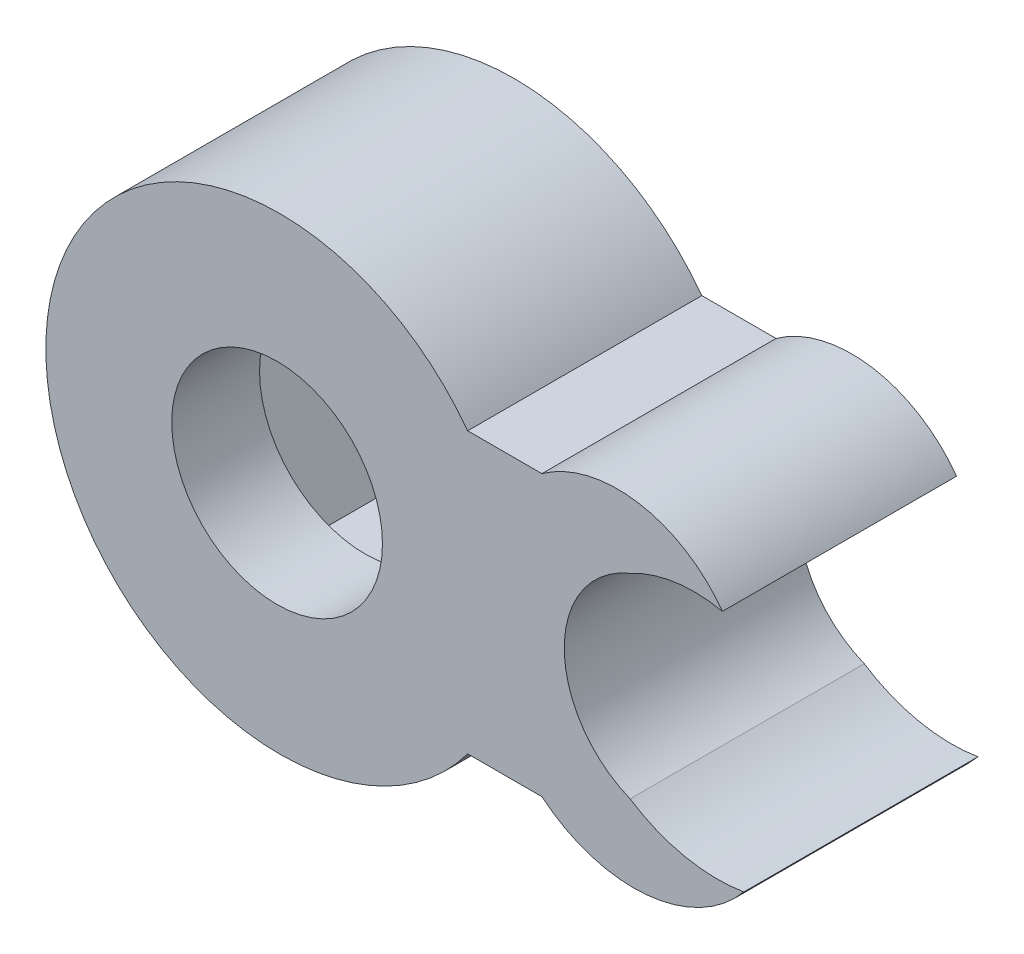
ISO-10303-21;
HEADER;
FILE_DESCRIPTION(('STEP AP214'),'2;1');
FILE_NAME('part.step','',(''),(''),'','','');
FILE_SCHEMA(('AUTOMOTIVE_DESIGN { 1 0 10303 214 1 1 1 1 }'));
ENDSEC;
DATA;
#1=APPLICATION_CONTEXT('core data for automotive mechanical design processes');
#2=APPLICATION_PROTOCOL_DEFINITION('international standard','automotive_design',2000,#1);
#3=PRODUCT_CONTEXT('',#1,'mechanical');
#4=PRODUCT('Part','Part','',(#3));
#5=PRODUCT_RELATED_PRODUCT_CATEGORY('part','',(#4));
#6=PRODUCT_DEFINITION_FORMATION('','',#4);
#7=PRODUCT_DEFINITION_CONTEXT('part definition',#1,'design');
#8=PRODUCT_DEFINITION('design','',#6,#7);
#9=PRODUCT_DEFINITION_SHAPE('','',#8);
#10=(LENGTH_UNIT() NAMED_UNIT(*) SI_UNIT(.MILLI.,.METRE.));
#11=(NAMED_UNIT(*) PLANE_ANGLE_UNIT() SI_UNIT($,.RADIAN.));
#12=(NAMED_UNIT(*) SI_UNIT($,.STERADIAN.) SOLID_ANGLE_UNIT());
#13=UNCERTAINTY_MEASURE_WITH_UNIT(LENGTH_MEASURE(1.E-05),#10,'distance_accuracy_value','');
#14=(GEOMETRIC_REPRESENTATION_CONTEXT(3) GLOBAL_UNCERTAINTY_ASSIGNED_CONTEXT((#13)) GLOBAL_UNIT_ASSIGNED_CONTEXT((#10,
#11,#12)) REPRESENTATION_CONTEXT('',''));
#15=CARTESIAN_POINT('',(0.,0.,0.));
#16=DIRECTION('',(0.,0.,1.));
#17=DIRECTION('',(1.,0.,0.));
#18=AXIS2_PLACEMENT_3D('',#15,#16,#17);
#19=CARTESIAN_POINT('',(0.,0.,0.));
#20=DIRECTION('',(0.,0.,1.));
#21=DIRECTION('',(1.,0.,0.));
#22=AXIS2_PLACEMENT_3D('',#19,#20,#21);
#23=PLANE('',#22);
#24=CARTESIAN_POINT('',(8.62330334265055,5.97504165381656,0.));
#25=DIRECTION('',(0.,0.,1.));
#26=DIRECTION('',(1.,0.,0.));
#27=AXIS2_PLACEMENT_3D('',#24,#25,#26);
#28=CIRCLE('',#27,4.5);
#29=CARTESIAN_POINT('',(6.93580334265055,10.1466533028079,0.));
#30=VERTEX_POINT('',#29);
#31=CARTESIAN_POINT('',(6.93580334265055,1.80343000482525,0.));
#32=VERTEX_POINT('',#31);
#33=EDGE_CURVE('E196',#30,#32,#28,.T.);
#34=ORIENTED_EDGE('',*,*,#33,.T.);
#35=CARTESIAN_POINT('',(10.6684287310235,7.53877576080524,0.));
#36=DIRECTION('',(0.,0.,1.));
#37=DIRECTION('',(-1.,0.,0.));
#38=AXIS2_PLACEMENT_3D('',#35,#36,#37);
#39=CIRCLE('',#38,6.84300250113675);
#40=CARTESIAN_POINT('',(11.795192236615,0.789176718415332,0.));
#41=VERTEX_POINT('',#40);
#42=EDGE_CURVE('E157',#32,#41,#39,.T.);
#43=ORIENTED_EDGE('',*,*,#42,.T.);
#44=CARTESIAN_POINT('',(7.08800775909984,4.70718447751529,0.));
#45=DIRECTION('',(0.,0.,-1.));
#46=DIRECTION('',(1.,0.,0.));
#47=AXIS2_PLACEMENT_3D('',#44,#45,#46);
#48=CIRCLE('',#47,6.12440776775415);
#49=CARTESIAN_POINT('',(3.17,0.,0.));
#50=VERTEX_POINT('',#49);
#51=EDGE_CURVE('E180',#41,#50,#48,.T.);
#52=ORIENTED_EDGE('',*,*,#51,.T.);
#53=DIRECTION('',(1.,0.,0.));
#54=VECTOR('',#53,1.);
#55=CARTESIAN_POINT('',(0.,0.,0.));
#56=LINE('',#55,#54);
#57=CARTESIAN_POINT('',(0.,0.,0.));
#58=VERTEX_POINT('',#57);
#59=EDGE_CURVE('E240',#58,#50,#56,.T.);
#60=ORIENTED_EDGE('',*,*,#59,.F.);
#61=CARTESIAN_POINT('',(-8.01865806947503,5.97504165381656,0.));
#62=DIRECTION('',(0.,0.,1.));
#63=DIRECTION('',(1.,0.,0.));
#64=AXIS2_PLACEMENT_3D('',#61,#62,#63);
#65=CIRCLE('',#64,10.);
#66=CARTESIAN_POINT('',(0.,11.9500833076331,0.));
#67=VERTEX_POINT('',#66);
#68=EDGE_CURVE('E243',#58,#67,#65,.F.);
#69=ORIENTED_EDGE('',*,*,#68,.T.);
#70=DIRECTION('',(1.,0.,0.));
#71=VECTOR('',#70,1.);
#72=CARTESIAN_POINT('',(0.,11.9500833076331,0.));
#73=LINE('',#72,#71);
#74=CARTESIAN_POINT('',(3.17,11.9500833076331,0.));
#75=VERTEX_POINT('',#74);
#76=EDGE_CURVE('E248',#67,#75,#73,.T.);
#77=ORIENTED_EDGE('',*,*,#76,.T.);
#78=CARTESIAN_POINT('',(6.40495500687242,7.47531307316342,0.));
#79=DIRECTION('',(0.,0.,-1.));
#80=DIRECTION('',(-1.,0.,0.));
#81=AXIS2_PLACEMENT_3D('',#78,#79,#80);
#82=CIRCLE('',#81,5.52163948006251);
#83=CARTESIAN_POINT('',(10.8797252413417,10.7102680800364,0.));
#84=VERTEX_POINT('',#83);
#85=EDGE_CURVE('E173',#75,#84,#82,.T.);
#86=ORIENTED_EDGE('',*,*,#85,.T.);
#87=CARTESIAN_POINT('',(9.67773467791841,5.04055535417208,0.));
#88=DIRECTION('',(0.,0.,1.));
#89=DIRECTION('',(-1.,0.,0.));
#90=AXIS2_PLACEMENT_3D('',#87,#88,#89);
#91=CIRCLE('',#90,5.79572460598211);
#92=EDGE_CURVE('E153',#84,#30,#91,.T.);
#93=ORIENTED_EDGE('',*,*,#92,.T.);
#94=EDGE_LOOP('',(#34,#43,#52,#60,#69,#77,#86,#93));
#95=FACE_BOUND('',#94,.T.);
#96=DIRECTION('',(0.999759336349186,-0.0219378527353114,0.));
#97=VECTOR('',#96,1.);
#98=CARTESIAN_POINT('',(-12.003000081239,-0.589130195444066,0.));
#99=LINE('',#98,#97);
#100=CARTESIAN_POINT('',(-12.003000081239,-0.589130195444065,0.));
#101=VERTEX_POINT('',#100);
#102=CARTESIAN_POINT('',(-4.32608949909066,-0.757585670366985,0.));
#103=VERTEX_POINT('',#102);
#104=EDGE_CURVE('E50',#101,#103,#99,.T.);
#105=ORIENTED_EDGE('',*,*,#104,.T.);
#106=DIRECTION('',(0.518878405947854,0.85484805658141,0.));
#107=VECTOR('',#106,1.);
#108=CARTESIAN_POINT('',(-4.32608949909066,-0.757585670366985,0.));
#109=LINE('',#108,#107);
#110=CARTESIAN_POINT('',(-0.341747487326646,5.80658617889364,0.));
#111=VERTEX_POINT('',#110);
#112=EDGE_CURVE('E215',#103,#111,#109,.T.);
#113=ORIENTED_EDGE('',*,*,#112,.T.);
#114=DIRECTION('',(-0.480880930401331,0.876785909316721,0.));
#115=VECTOR('',#114,1.);
#116=CARTESIAN_POINT('',(-0.341747487326646,5.80658617889364,0.));
#117=LINE('',#116,#115);
#118=CARTESIAN_POINT('',(-4.03431605771102,12.5392135030772,0.));
#119=VERTEX_POINT('',#118);
#120=EDGE_CURVE('E218',#111,#119,#117,.T.);
#121=ORIENTED_EDGE('',*,*,#120,.T.);
#122=DIRECTION('',(-0.999759336349186,0.0219378527353115,0.));
#123=VECTOR('',#122,1.);
#124=CARTESIAN_POINT('',(-4.03431605771102,12.5392135030772,0.));
#125=LINE('',#124,#123);
#126=CARTESIAN_POINT('',(-11.7112266398594,12.7076689780001,0.));
#127=VERTEX_POINT('',#126);
#128=EDGE_CURVE('E221',#119,#127,#125,.T.);
#129=ORIENTED_EDGE('',*,*,#128,.T.);
#130=DIRECTION('',(-0.518878405947854,-0.85484805658141,0.));
#131=VECTOR('',#130,1.);
#132=CARTESIAN_POINT('',(-11.7112266398594,12.7076689780001,0.));
#133=LINE('',#132,#131);
#134=CARTESIAN_POINT('',(-15.6955686516234,6.14349712873948,0.));
#135=VERTEX_POINT('',#134);
#136=EDGE_CURVE('E224',#127,#135,#133,.T.);
#137=ORIENTED_EDGE('',*,*,#136,.T.);
#138=DIRECTION('',(0.480880930401331,-0.876785909316722,0.));
#139=VECTOR('',#138,1.);
#140=CARTESIAN_POINT('',(-15.6955686516234,6.14349712873948,0.));
#141=LINE('',#140,#139);
#142=EDGE_CURVE('E203',#135,#101,#141,.T.);
#143=ORIENTED_EDGE('',*,*,#142,.T.);
#144=EDGE_LOOP('',(#105,#113,#121,#129,#137,#143));
#145=FACE_BOUND('',#144,.T.);
#146=ADVANCED_FACE('F35',(#95,#145),#23,.F.);
#147=CARTESIAN_POINT('',(0.,0.,10.));
#148=DIRECTION('',(0.,1.,0.));
#149=DIRECTION('',(0.,0.,1.));
#150=AXIS2_PLACEMENT_3D('',#147,#148,#149);
#151=PLANE('',#150);
#152=ORIENTED_EDGE('',*,*,#59,.T.);
#153=DIRECTION('',(0.,0.,-1.));
#154=VECTOR('',#153,1.);
#155=CARTESIAN_POINT('',(3.17,0.,10.));
#156=LINE('',#155,#154);
#157=CARTESIAN_POINT('',(3.17,0.,10.));
#158=VERTEX_POINT('',#157);
#159=EDGE_CURVE('E257',#158,#50,#156,.T.);
#160=ORIENTED_EDGE('',*,*,#159,.F.);
#161=DIRECTION('',(1.,0.,0.));
#162=VECTOR('',#161,1.);
#163=CARTESIAN_POINT('',(0.,0.,10.));
#164=LINE('',#163,#162);
#165=CARTESIAN_POINT('',(0.,0.,10.));
#166=VERTEX_POINT('',#165);
#167=EDGE_CURVE('E84',#166,#158,#164,.T.);
#168=ORIENTED_EDGE('',*,*,#167,.F.);
#169=DIRECTION('',(0.,0.,-1.));
#170=VECTOR('',#169,1.);
#171=CARTESIAN_POINT('',(0.,0.,10.));
#172=LINE('',#171,#170);
#173=EDGE_CURVE('E59',#166,#58,#172,.T.);
#174=ORIENTED_EDGE('',*,*,#173,.T.);
#175=EDGE_LOOP('',(#152,#160,#168,#174));
#176=FACE_BOUND('',#175,.T.);
#177=ADVANCED_FACE('F37',(#176),#151,.F.);
#178=CARTESIAN_POINT('',(0.,11.9500833076331,10.));
#179=DIRECTION('',(0.,1.,0.));
#180=DIRECTION('',(0.,0.,1.));
#181=AXIS2_PLACEMENT_3D('',#178,#179,#180);
#182=PLANE('',#181);
#183=ORIENTED_EDGE('',*,*,#76,.F.);
#184=DIRECTION('',(0.,0.,-1.));
#185=VECTOR('',#184,1.);
#186=CARTESIAN_POINT('',(0.,11.9500833076331,10.));
#187=LINE('',#186,#185);
#188=CARTESIAN_POINT('',(0.,11.9500833076331,10.));
#189=VERTEX_POINT('',#188);
#190=EDGE_CURVE('E254',#189,#67,#187,.T.);
#191=ORIENTED_EDGE('',*,*,#190,.F.);
#192=DIRECTION('',(1.,0.,0.));
#193=VECTOR('',#192,1.);
#194=CARTESIAN_POINT('',(0.,11.9500833076331,10.));
#195=LINE('',#194,#193);
#196=CARTESIAN_POINT('',(3.17,11.9500833076331,10.));
#197=VERTEX_POINT('',#196);
#198=EDGE_CURVE('E242',#189,#197,#195,.T.);
#199=ORIENTED_EDGE('',*,*,#198,.T.);
#200=DIRECTION('',(0.,0.,-1.));
#201=VECTOR('',#200,1.);
#202=CARTESIAN_POINT('',(3.17,11.9500833076331,10.));
#203=LINE('',#202,#201);
#204=EDGE_CURVE('E163',#197,#75,#203,.T.);
#205=ORIENTED_EDGE('',*,*,#204,.T.);
#206=EDGE_LOOP('',(#183,#191,#199,#205));
#207=FACE_BOUND('',#206,.T.);
#208=ADVANCED_FACE('F265',(#207),#182,.T.);
#209=CARTESIAN_POINT('',(-8.01865806947503,5.97504165381656,10.));
#210=DIRECTION('',(0.,0.,-1.));
#211=DIRECTION('',(-1.,0.,0.));
#212=AXIS2_PLACEMENT_3D('',#209,#210,#211);
#213=CYLINDRICAL_SURFACE('',#212,10.);
#214=ORIENTED_EDGE('',*,*,#68,.F.);
#215=ORIENTED_EDGE('',*,*,#173,.F.);
#216=CARTESIAN_POINT('',(-8.01865806947503,5.97504165381656,10.));
#217=DIRECTION('',(0.,0.,1.));
#218=DIRECTION('',(1.,0.,0.));
#219=AXIS2_PLACEMENT_3D('',#216,#217,#218);
#220=CIRCLE('',#219,10.);
#221=EDGE_CURVE('E245',#166,#189,#220,.F.);
#222=ORIENTED_EDGE('',*,*,#221,.T.);
#223=ORIENTED_EDGE('',*,*,#190,.T.);
#224=EDGE_LOOP('',(#214,#215,#222,#223));
#225=FACE_BOUND('',#224,.T.);
#226=ADVANCED_FACE('F266',(#225),#213,.T.);
#227=CARTESIAN_POINT('',(0.,0.,10.));
#228=DIRECTION('',(0.,0.,1.));
#229=DIRECTION('',(1.,0.,0.));
#230=AXIS2_PLACEMENT_3D('',#227,#228,#229);
#231=PLANE('',#230);
#232=CARTESIAN_POINT('',(8.62330334267549,5.97504165381656,10.));
#233=DIRECTION('',(0.,0.,1.));
#234=DIRECTION('',(1.,0.,0.));
#235=AXIS2_PLACEMENT_3D('',#232,#233,#234);
#236=CIRCLE('',#235,4.50000000000935);
#237=CARTESIAN_POINT('',(6.93580334265055,10.1466533028079,10.));
#238=VERTEX_POINT('',#237);
#239=CARTESIAN_POINT('',(6.93580334265055,1.80343000482525,10.));
#240=VERTEX_POINT('',#239);
#241=EDGE_CURVE('E170',#238,#240,#236,.T.);
#242=ORIENTED_EDGE('',*,*,#241,.F.);
#243=CARTESIAN_POINT('',(9.67773467791841,5.04055535417208,10.));
#244=DIRECTION('',(0.,0.,1.));
#245=DIRECTION('',(-1.,0.,0.));
#246=AXIS2_PLACEMENT_3D('',#243,#244,#245);
#247=CIRCLE('',#246,5.79572460598211);
#248=CARTESIAN_POINT('',(10.8797252413417,10.7102680800364,10.));
#249=VERTEX_POINT('',#248);
#250=EDGE_CURVE('E151',#249,#238,#247,.T.);
#251=ORIENTED_EDGE('',*,*,#250,.F.);
#252=CARTESIAN_POINT('',(6.40495500687242,7.47531307316342,10.));
#253=DIRECTION('',(0.,0.,-1.));
#254=DIRECTION('',(-1.,0.,0.));
#255=AXIS2_PLACEMENT_3D('',#252,#253,#254);
#256=CIRCLE('',#255,5.52163948006251);
#257=EDGE_CURVE('E161',#197,#249,#256,.T.);
#258=ORIENTED_EDGE('',*,*,#257,.F.);
#259=ORIENTED_EDGE('',*,*,#198,.F.);
#260=ORIENTED_EDGE('',*,*,#221,.F.);
#261=ORIENTED_EDGE('',*,*,#167,.T.);
#262=CARTESIAN_POINT('',(7.08800775909984,4.70718447751529,10.));
#263=DIRECTION('',(0.,0.,-1.));
#264=DIRECTION('',(1.,0.,0.));
#265=AXIS2_PLACEMENT_3D('',#262,#263,#264);
#266=CIRCLE('',#265,6.12440776775415);
#267=CARTESIAN_POINT('',(11.795192236615,0.789176718415332,10.));
#268=VERTEX_POINT('',#267);
#269=EDGE_CURVE('E179',#268,#158,#266,.T.);
#270=ORIENTED_EDGE('',*,*,#269,.F.);
#271=CARTESIAN_POINT('',(10.6684287310235,7.53877576080524,10.));
#272=DIRECTION('',(0.,0.,1.));
#273=DIRECTION('',(-1.,0.,0.));
#274=AXIS2_PLACEMENT_3D('',#271,#272,#273);
#275=CIRCLE('',#274,6.84300250113675);
#276=EDGE_CURVE('E176',#240,#268,#275,.T.);
#277=ORIENTED_EDGE('',*,*,#276,.F.);
#278=EDGE_LOOP('',(#242,#251,#258,#259,#260,#261,#270,#277));
#279=FACE_BOUND('',#278,.T.);
#280=CARTESIAN_POINT('',(-8.14102858270793,5.95135062226859,10.));
#281=DIRECTION('',(0.,0.,1.));
#282=DIRECTION('',(1.,0.,0.));
#283=AXIS2_PLACEMENT_3D('',#280,#281,#282);
#284=CIRCLE('',#283,4.5);
#285=CARTESIAN_POINT('',(-3.64102858270793,5.95135062226859,10.));
#286=VERTEX_POINT('',#285);
#287=EDGE_CURVE('E193',#286,#286,#284,.T.);
#288=ORIENTED_EDGE('',*,*,#287,.F.);
#289=EDGE_LOOP('',(#288));
#290=FACE_BOUND('',#289,.T.);
#291=ADVANCED_FACE('F167',(#279,#290),#231,.T.);
#292=CARTESIAN_POINT('',(-12.003000081239,-0.589130195444066,6.25));
#293=DIRECTION('',(0.0219378527353114,0.999759336349185,0.));
#294=DIRECTION('',(-0.999759336349185,0.0219378527353114,0.));
#295=AXIS2_PLACEMENT_3D('',#292,#293,#294);
#296=PLANE('',#295);
#297=ORIENTED_EDGE('',*,*,#104,.F.);
#298=DIRECTION('',(0.,0.,-1.));
#299=VECTOR('',#298,1.);
#300=CARTESIAN_POINT('',(-12.003000081239,-0.589130195444066,6.25));
#301=LINE('',#300,#299);
#302=CARTESIAN_POINT('',(-12.003000081239,-0.589130195444066,6.25));
#303=VERTEX_POINT('',#302);
#304=EDGE_CURVE('E213',#303,#101,#301,.T.);
#305=ORIENTED_EDGE('',*,*,#304,.F.);
#306=DIRECTION('',(0.999759336349186,-0.0219378527353114,0.));
#307=VECTOR('',#306,1.);
#308=CARTESIAN_POINT('',(-12.003000081239,-0.589130195444066,6.25));
#309=LINE('',#308,#307);
#310=CARTESIAN_POINT('',(-4.32608949909066,-0.757585670366985,6.25));
#311=VERTEX_POINT('',#310);
#312=EDGE_CURVE('E199',#303,#311,#309,.T.);
#313=ORIENTED_EDGE('',*,*,#312,.T.);
#314=DIRECTION('',(0.,0.,-1.));
#315=VECTOR('',#314,1.);
#316=CARTESIAN_POINT('',(-4.32608949909066,-0.757585670366985,6.25));
#317=LINE('',#316,#315);
#318=EDGE_CURVE('E238',#311,#103,#317,.T.);
#319=ORIENTED_EDGE('',*,*,#318,.T.);
#320=EDGE_LOOP('',(#297,#305,#313,#319));
#321=FACE_BOUND('',#320,.T.);
#322=ADVANCED_FACE('F273',(#321),#296,.T.);
#323=CARTESIAN_POINT('',(-4.32608949909066,-0.757585670366985,6.25));
#324=DIRECTION('',(-0.85484805658141,0.518878405947854,0.));
#325=DIRECTION('',(-0.518878405947854,-0.85484805658141,0.));
#326=AXIS2_PLACEMENT_3D('',#323,#324,#325);
#327=PLANE('',#326);
#328=ORIENTED_EDGE('',*,*,#112,.F.);
#329=ORIENTED_EDGE('',*,*,#318,.F.);
#330=DIRECTION('',(0.518878405947854,0.85484805658141,0.));
#331=VECTOR('',#330,1.);
#332=CARTESIAN_POINT('',(-4.32608949909066,-0.757585670366985,6.25));
#333=LINE('',#332,#331);
#334=CARTESIAN_POINT('',(-0.341747487326646,5.80658617889364,6.25));
#335=VERTEX_POINT('',#334);
#336=EDGE_CURVE('E202',#311,#335,#333,.T.);
#337=ORIENTED_EDGE('',*,*,#336,.T.);
#338=DIRECTION('',(0.,0.,-1.));
#339=VECTOR('',#338,1.);
#340=CARTESIAN_POINT('',(-0.341747487326646,5.80658617889364,6.25));
#341=LINE('',#340,#339);
#342=EDGE_CURVE('E236',#335,#111,#341,.T.);
#343=ORIENTED_EDGE('',*,*,#342,.T.);
#344=EDGE_LOOP('',(#328,#329,#337,#343));
#345=FACE_BOUND('',#344,.T.);
#346=ADVANCED_FACE('F283',(#345),#327,.T.);
#347=CARTESIAN_POINT('',(-0.341747487326646,5.80658617889364,6.25));
#348=DIRECTION('',(-0.876785909316721,-0.480880930401331,0.));
#349=DIRECTION('',(0.480880930401331,-0.876785909316721,0.));
#350=AXIS2_PLACEMENT_3D('',#347,#348,#349);
#351=PLANE('',#350);
#352=ORIENTED_EDGE('',*,*,#120,.F.);
#353=ORIENTED_EDGE('',*,*,#342,.F.);
#354=DIRECTION('',(-0.480880930401331,0.876785909316721,0.));
#355=VECTOR('',#354,1.);
#356=CARTESIAN_POINT('',(-0.341747487326646,5.80658617889364,6.25));
#357=LINE('',#356,#355);
#358=CARTESIAN_POINT('',(-4.03431605771102,12.5392135030772,6.25));
#359=VERTEX_POINT('',#358);
#360=EDGE_CURVE('E205',#335,#359,#357,.T.);
#361=ORIENTED_EDGE('',*,*,#360,.T.);
#362=DIRECTION('',(0.,0.,-1.));
#363=VECTOR('',#362,1.);
#364=CARTESIAN_POINT('',(-4.03431605771102,12.5392135030772,6.25));
#365=LINE('',#364,#363);
#366=EDGE_CURVE('E234',#359,#119,#365,.T.);
#367=ORIENTED_EDGE('',*,*,#366,.T.);
#368=EDGE_LOOP('',(#352,#353,#361,#367));
#369=FACE_BOUND('',#368,.T.);
#370=ADVANCED_FACE('F286',(#369),#351,.T.);
#371=CARTESIAN_POINT('',(-4.03431605771102,12.5392135030772,6.25));
#372=DIRECTION('',(-0.0219378527353115,-0.999759336349185,0.));
#373=DIRECTION('',(0.999759336349185,-0.0219378527353115,0.));
#374=AXIS2_PLACEMENT_3D('',#371,#372,#373);
#375=PLANE('',#374);
#376=ORIENTED_EDGE('',*,*,#128,.F.);
#377=ORIENTED_EDGE('',*,*,#366,.F.);
#378=DIRECTION('',(-0.999759336349186,0.0219378527353115,0.));
#379=VECTOR('',#378,1.);
#380=CARTESIAN_POINT('',(-4.03431605771102,12.5392135030772,6.25));
#381=LINE('',#380,#379);
#382=CARTESIAN_POINT('',(-11.7112266398594,12.7076689780001,6.25));
#383=VERTEX_POINT('',#382);
#384=EDGE_CURVE('E207',#359,#383,#381,.T.);
#385=ORIENTED_EDGE('',*,*,#384,.T.);
#386=DIRECTION('',(0.,0.,-1.));
#387=VECTOR('',#386,1.);
#388=CARTESIAN_POINT('',(-11.7112266398594,12.7076689780001,6.25));
#389=LINE('',#388,#387);
#390=EDGE_CURVE('E232',#383,#127,#389,.T.);
#391=ORIENTED_EDGE('',*,*,#390,.T.);
#392=EDGE_LOOP('',(#376,#377,#385,#391));
#393=FACE_BOUND('',#392,.T.);
#394=ADVANCED_FACE('F290',(#393),#375,.T.);
#395=CARTESIAN_POINT('',(-11.7112266398594,12.7076689780001,6.25));
#396=DIRECTION('',(0.85484805658141,-0.518878405947854,0.));
#397=DIRECTION('',(0.518878405947854,0.85484805658141,0.));
#398=AXIS2_PLACEMENT_3D('',#395,#396,#397);
#399=PLANE('',#398);
#400=ORIENTED_EDGE('',*,*,#136,.F.);
#401=ORIENTED_EDGE('',*,*,#390,.F.);
#402=DIRECTION('',(-0.518878405947854,-0.85484805658141,0.));
#403=VECTOR('',#402,1.);
#404=CARTESIAN_POINT('',(-11.7112266398594,12.7076689780001,6.25));
#405=LINE('',#404,#403);
#406=CARTESIAN_POINT('',(-15.6955686516234,6.14349712873948,6.25));
#407=VERTEX_POINT('',#406);
#408=EDGE_CURVE('E209',#383,#407,#405,.T.);
#409=ORIENTED_EDGE('',*,*,#408,.T.);
#410=DIRECTION('',(0.,0.,-1.));
#411=VECTOR('',#410,1.);
#412=CARTESIAN_POINT('',(-15.6955686516234,6.14349712873948,6.25));
#413=LINE('',#412,#411);
#414=EDGE_CURVE('E230',#407,#135,#413,.T.);
#415=ORIENTED_EDGE('',*,*,#414,.T.);
#416=EDGE_LOOP('',(#400,#401,#409,#415));
#417=FACE_BOUND('',#416,.T.);
#418=ADVANCED_FACE('F294',(#417),#399,.T.);
#419=CARTESIAN_POINT('',(-15.6955686516234,6.14349712873948,6.25));
#420=DIRECTION('',(0.876785909316721,0.480880930401331,0.));
#421=DIRECTION('',(-0.480880930401331,0.876785909316722,0.));
#422=AXIS2_PLACEMENT_3D('',#419,#420,#421);
#423=PLANE('',#422);
#424=ORIENTED_EDGE('',*,*,#142,.F.);
#425=ORIENTED_EDGE('',*,*,#414,.F.);
#426=DIRECTION('',(0.480880930401331,-0.876785909316722,0.));
#427=VECTOR('',#426,1.);
#428=CARTESIAN_POINT('',(-15.6955686516234,6.14349712873948,6.25));
#429=LINE('',#428,#427);
#430=EDGE_CURVE('E211',#407,#303,#429,.T.);
#431=ORIENTED_EDGE('',*,*,#430,.T.);
#432=ORIENTED_EDGE('',*,*,#304,.T.);
#433=EDGE_LOOP('',(#424,#425,#431,#432));
#434=FACE_BOUND('',#433,.T.);
#435=ADVANCED_FACE('F298',(#434),#423,.T.);
#436=CARTESIAN_POINT('',(0.,0.,6.25));
#437=DIRECTION('',(0.,0.,1.));
#438=DIRECTION('',(1.,0.,0.));
#439=AXIS2_PLACEMENT_3D('',#436,#437,#438);
#440=PLANE('',#439);
#441=CARTESIAN_POINT('',(-8.14102858270793,5.95135062226859,6.25));
#442=DIRECTION('',(0.,0.,-1.));
#443=DIRECTION('',(-1.,0.,0.));
#444=AXIS2_PLACEMENT_3D('',#441,#442,#443);
#445=CIRCLE('',#444,4.5);
#446=CARTESIAN_POINT('',(-12.6410285827079,5.95135062226859,6.25));
#447=VERTEX_POINT('',#446);
#448=EDGE_CURVE('E190',#447,#447,#445,.T.);
#449=ORIENTED_EDGE('',*,*,#448,.F.);
#450=EDGE_LOOP('',(#449));
#451=FACE_BOUND('',#450,.T.);
#452=ORIENTED_EDGE('',*,*,#312,.F.);
#453=ORIENTED_EDGE('',*,*,#430,.F.);
#454=ORIENTED_EDGE('',*,*,#408,.F.);
#455=ORIENTED_EDGE('',*,*,#384,.F.);
#456=ORIENTED_EDGE('',*,*,#360,.F.);
#457=ORIENTED_EDGE('',*,*,#336,.F.);
#458=EDGE_LOOP('',(#452,#453,#454,#455,#456,#457));
#459=FACE_BOUND('',#458,.T.);
#460=ADVANCED_FACE('F302',(#451,#459),#440,.F.);
#461=CARTESIAN_POINT('',(8.62330334265055,5.97504165381656,6.25));
#462=DIRECTION('',(0.,0.,-1.));
#463=DIRECTION('',(-1.,0.,0.));
#464=AXIS2_PLACEMENT_3D('',#461,#462,#463);
#465=CYLINDRICAL_SURFACE('',#464,4.5);
#466=ORIENTED_EDGE('',*,*,#33,.F.);
#467=DIRECTION('',(0.,0.,-1.));
#468=VECTOR('',#467,1.);
#469=CARTESIAN_POINT('',(6.93580334265055,10.1466533028079,3.125));
#470=LINE('',#469,#468);
#471=EDGE_CURVE('E43',#238,#30,#470,.T.);
#472=ORIENTED_EDGE('',*,*,#471,.F.);
#473=ORIENTED_EDGE('',*,*,#241,.T.);
#474=DIRECTION('',(0.,0.,-1.));
#475=VECTOR('',#474,1.);
#476=CARTESIAN_POINT('',(6.93580334265055,1.80343000482525,3.125));
#477=LINE('',#476,#475);
#478=EDGE_CURVE('E11',#32,#240,#477,.F.);
#479=ORIENTED_EDGE('',*,*,#478,.F.);
#480=EDGE_LOOP('',(#466,#472,#473,#479));
#481=FACE_BOUND('',#480,.T.);
#482=ADVANCED_FACE('F306',(#481),#465,.F.);
#483=CARTESIAN_POINT('',(-8.14102858270793,5.95135062226859,16.25));
#484=DIRECTION('',(0.,0.,-1.));
#485=DIRECTION('',(-1.,0.,0.));
#486=AXIS2_PLACEMENT_3D('',#483,#484,#485);
#487=CYLINDRICAL_SURFACE('',#486,4.5);
#488=ORIENTED_EDGE('',*,*,#287,.T.);
#489=EDGE_LOOP('',(#488));
#490=FACE_BOUND('',#489,.T.);
#491=ORIENTED_EDGE('',*,*,#448,.T.);
#492=EDGE_LOOP('',(#491));
#493=FACE_BOUND('',#492,.T.);
#494=ADVANCED_FACE('F310',(#490,#493),#487,.F.);
#495=CARTESIAN_POINT('',(7.08800775909984,4.70718447751529,10.));
#496=DIRECTION('',(0.,0.,-1.));
#497=DIRECTION('',(-1.,0.,0.));
#498=AXIS2_PLACEMENT_3D('',#495,#496,#497);
#499=CYLINDRICAL_SURFACE('',#498,6.12440776775415);
#500=ORIENTED_EDGE('',*,*,#51,.F.);
#501=DIRECTION('',(0.,0.,-1.));
#502=VECTOR('',#501,1.);
#503=CARTESIAN_POINT('',(11.795192236615,0.789176718415332,10.));
#504=LINE('',#503,#502);
#505=EDGE_CURVE('E183',#268,#41,#504,.T.);
#506=ORIENTED_EDGE('',*,*,#505,.F.);
#507=ORIENTED_EDGE('',*,*,#269,.T.);
#508=ORIENTED_EDGE('',*,*,#159,.T.);
#509=EDGE_LOOP('',(#500,#506,#507,#508));
#510=FACE_BOUND('',#509,.T.);
#511=ADVANCED_FACE('F313',(#510),#499,.T.);
#512=CARTESIAN_POINT('',(10.6684287310235,7.53877576080524,10.));
#513=DIRECTION('',(0.,0.,-1.));
#514=DIRECTION('',(-1.,0.,0.));
#515=AXIS2_PLACEMENT_3D('',#512,#513,#514);
#516=CYLINDRICAL_SURFACE('',#515,6.84300250113675);
#517=ORIENTED_EDGE('',*,*,#42,.F.);
#518=ORIENTED_EDGE('',*,*,#478,.T.);
#519=ORIENTED_EDGE('',*,*,#276,.T.);
#520=ORIENTED_EDGE('',*,*,#505,.T.);
#521=EDGE_LOOP('',(#517,#518,#519,#520));
#522=FACE_BOUND('',#521,.T.);
#523=ADVANCED_FACE('F315',(#522),#516,.F.);
#524=CARTESIAN_POINT('',(9.67773467791841,5.04055535417208,10.));
#525=DIRECTION('',(0.,0.,-1.));
#526=DIRECTION('',(-1.,0.,0.));
#527=AXIS2_PLACEMENT_3D('',#524,#525,#526);
#528=CYLINDRICAL_SURFACE('',#527,5.79572460598211);
#529=ORIENTED_EDGE('',*,*,#92,.F.);
#530=DIRECTION('',(0.,0.,-1.));
#531=VECTOR('',#530,1.);
#532=CARTESIAN_POINT('',(10.8797252413417,10.7102680800364,10.));
#533=LINE('',#532,#531);
#534=EDGE_CURVE('E146',#249,#84,#533,.T.);
#535=ORIENTED_EDGE('',*,*,#534,.F.);
#536=ORIENTED_EDGE('',*,*,#250,.T.);
#537=ORIENTED_EDGE('',*,*,#471,.T.);
#538=EDGE_LOOP('',(#529,#535,#536,#537));
#539=FACE_BOUND('',#538,.T.);
#540=ADVANCED_FACE('F148',(#539),#528,.F.);
#541=CARTESIAN_POINT('',(6.40495500687242,7.47531307316342,10.));
#542=DIRECTION('',(0.,0.,-1.));
#543=DIRECTION('',(-1.,0.,0.));
#544=AXIS2_PLACEMENT_3D('',#541,#542,#543);
#545=CYLINDRICAL_SURFACE('',#544,5.52163948006251);
#546=ORIENTED_EDGE('',*,*,#85,.F.);
#547=ORIENTED_EDGE('',*,*,#204,.F.);
#548=ORIENTED_EDGE('',*,*,#257,.T.);
#549=ORIENTED_EDGE('',*,*,#534,.T.);
#550=EDGE_LOOP('',(#546,#547,#548,#549));
#551=FACE_BOUND('',#550,.T.);
#552=ADVANCED_FACE('F162',(#551),#545,.T.);
#553=CLOSED_SHELL('',(#146,#177,#208,#226,#291,#322,#346,#370,#394,#418,#435,#460,#482,#494,
#511,#523,#540,#552));
#554=MANIFOLD_SOLID_BREP('B2',#553);
#555=ADVANCED_BREP_SHAPE_REPRESENTATION('',(#18,#554),#14);
#556=SHAPE_DEFINITION_REPRESENTATION(#9,#555);
ENDSEC;
END-ISO-10303-21;
